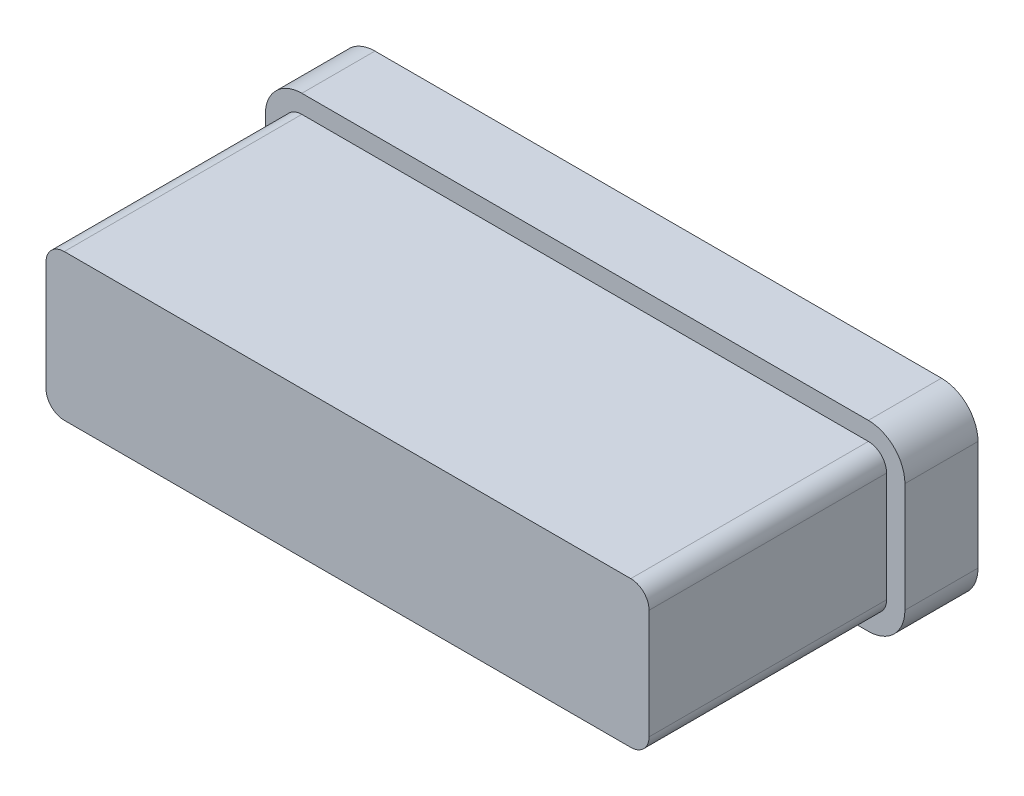
ISO-10303-21;
HEADER;
FILE_DESCRIPTION(('STEP AP214'),'2;1');
FILE_NAME('part.step','',(''),(''),'','','');
FILE_SCHEMA(('AUTOMOTIVE_DESIGN { 1 0 10303 214 1 1 1 1 }'));
ENDSEC;
DATA;
#1=APPLICATION_CONTEXT('core data for automotive mechanical design processes');
#2=APPLICATION_PROTOCOL_DEFINITION('international standard','automotive_design',2000,#1);
#3=PRODUCT_CONTEXT('',#1,'mechanical');
#4=PRODUCT('Part','Part','',(#3));
#5=PRODUCT_RELATED_PRODUCT_CATEGORY('part','',(#4));
#6=PRODUCT_DEFINITION_FORMATION('','',#4);
#7=PRODUCT_DEFINITION_CONTEXT('part definition',#1,'design');
#8=PRODUCT_DEFINITION('design','',#6,#7);
#9=PRODUCT_DEFINITION_SHAPE('','',#8);
#10=(LENGTH_UNIT() NAMED_UNIT(*) SI_UNIT(.MILLI.,.METRE.));
#11=(NAMED_UNIT(*) PLANE_ANGLE_UNIT() SI_UNIT($,.RADIAN.));
#12=(NAMED_UNIT(*) SI_UNIT($,.STERADIAN.) SOLID_ANGLE_UNIT());
#13=UNCERTAINTY_MEASURE_WITH_UNIT(LENGTH_MEASURE(1.E-05),#10,'distance_accuracy_value','');
#14=(GEOMETRIC_REPRESENTATION_CONTEXT(3) GLOBAL_UNCERTAINTY_ASSIGNED_CONTEXT((#13)) GLOBAL_UNIT_ASSIGNED_CONTEXT((#10,
#11,#12)) REPRESENTATION_CONTEXT('',''));
#15=CARTESIAN_POINT('',(0.,0.,0.));
#16=DIRECTION('',(0.,0.,1.));
#17=DIRECTION('',(1.,0.,0.));
#18=AXIS2_PLACEMENT_3D('',#15,#16,#17);
#19=CARTESIAN_POINT('',(0.,0.,4.));
#20=DIRECTION('',(0.,0.,-1.));
#21=DIRECTION('',(-1.,0.,0.));
#22=AXIS2_PLACEMENT_3D('',#19,#20,#21);
#23=PLANE('',#22);
#24=DIRECTION('',(0.,-1.,0.));
#25=VECTOR('',#24,1.);
#26=CARTESIAN_POINT('',(-17.5,-5.,4.));
#27=LINE('',#26,#25);
#28=CARTESIAN_POINT('',(-17.5,3.,4.));
#29=VERTEX_POINT('',#28);
#30=CARTESIAN_POINT('',(-17.5,-3.,4.));
#31=VERTEX_POINT('',#30);
#32=EDGE_CURVE('E196',#29,#31,#27,.T.);
#33=ORIENTED_EDGE('',*,*,#32,.T.);
#34=CARTESIAN_POINT('',(-15.5,-3.,4.));
#35=DIRECTION('',(0.,0.,-1.));
#36=DIRECTION('',(-1.,0.,0.));
#37=AXIS2_PLACEMENT_3D('',#34,#35,#36);
#38=CIRCLE('',#37,2.);
#39=CARTESIAN_POINT('',(-15.5,-5.,4.));
#40=VERTEX_POINT('',#39);
#41=EDGE_CURVE('E249',#31,#40,#38,.F.);
#42=ORIENTED_EDGE('',*,*,#41,.T.);
#43=DIRECTION('',(1.,0.,0.));
#44=VECTOR('',#43,1.);
#45=CARTESIAN_POINT('',(-17.5,-5.,4.));
#46=LINE('',#45,#44);
#47=CARTESIAN_POINT('',(15.5,-5.,4.));
#48=VERTEX_POINT('',#47);
#49=EDGE_CURVE('E200',#40,#48,#46,.T.);
#50=ORIENTED_EDGE('',*,*,#49,.T.);
#51=CARTESIAN_POINT('',(15.5,-3.,4.));
#52=DIRECTION('',(0.,0.,-1.));
#53=DIRECTION('',(-1.,0.,0.));
#54=AXIS2_PLACEMENT_3D('',#51,#52,#53);
#55=CIRCLE('',#54,2.);
#56=CARTESIAN_POINT('',(17.5,-3.,4.));
#57=VERTEX_POINT('',#56);
#58=EDGE_CURVE('E243',#48,#57,#55,.F.);
#59=ORIENTED_EDGE('',*,*,#58,.T.);
#60=DIRECTION('',(0.,1.,0.));
#61=VECTOR('',#60,1.);
#62=CARTESIAN_POINT('',(17.5,-5.,4.));
#63=LINE('',#62,#61);
#64=CARTESIAN_POINT('',(17.5,3.,4.));
#65=VERTEX_POINT('',#64);
#66=EDGE_CURVE('E187',#57,#65,#63,.T.);
#67=ORIENTED_EDGE('',*,*,#66,.T.);
#68=CARTESIAN_POINT('',(15.5,3.,4.));
#69=DIRECTION('',(0.,0.,-1.));
#70=DIRECTION('',(-1.,0.,0.));
#71=AXIS2_PLACEMENT_3D('',#68,#69,#70);
#72=CIRCLE('',#71,2.);
#73=CARTESIAN_POINT('',(15.5,5.,4.));
#74=VERTEX_POINT('',#73);
#75=EDGE_CURVE('E240',#65,#74,#72,.F.);
#76=ORIENTED_EDGE('',*,*,#75,.T.);
#77=DIRECTION('',(-1.,0.,0.));
#78=VECTOR('',#77,1.);
#79=CARTESIAN_POINT('',(-17.5,5.,4.));
#80=LINE('',#79,#78);
#81=CARTESIAN_POINT('',(-15.5,5.,4.));
#82=VERTEX_POINT('',#81);
#83=EDGE_CURVE('E191',#74,#82,#80,.T.);
#84=ORIENTED_EDGE('',*,*,#83,.T.);
#85=CARTESIAN_POINT('',(-15.5,3.,4.));
#86=DIRECTION('',(0.,0.,-1.));
#87=DIRECTION('',(-1.,0.,0.));
#88=AXIS2_PLACEMENT_3D('',#85,#86,#87);
#89=CIRCLE('',#88,2.);
#90=EDGE_CURVE('E246',#82,#29,#89,.F.);
#91=ORIENTED_EDGE('',*,*,#90,.T.);
#92=EDGE_LOOP('',(#33,#42,#50,#59,#67,#76,#84,#91));
#93=FACE_BOUND('',#92,.T.);
#94=CARTESIAN_POINT('',(-15.5,3.,4.));
#95=DIRECTION('',(0.,0.,1.));
#96=DIRECTION('',(1.,0.,0.));
#97=AXIS2_PLACEMENT_3D('',#94,#95,#96);
#98=CIRCLE('',#97,1.);
#99=CARTESIAN_POINT('',(-15.5,4.,4.));
#100=VERTEX_POINT('',#99);
#101=CARTESIAN_POINT('',(-16.5,3.,4.));
#102=VERTEX_POINT('',#101);
#103=EDGE_CURVE('E55',#100,#102,#98,.T.);
#104=ORIENTED_EDGE('',*,*,#103,.F.);
#105=DIRECTION('',(-1.,0.,0.));
#106=VECTOR('',#105,1.);
#107=CARTESIAN_POINT('',(15.5,4.,4.));
#108=LINE('',#107,#106);
#109=CARTESIAN_POINT('',(15.5,4.,4.));
#110=VERTEX_POINT('',#109);
#111=EDGE_CURVE('E59',#110,#100,#108,.T.);
#112=ORIENTED_EDGE('',*,*,#111,.F.);
#113=CARTESIAN_POINT('',(15.5,3.,4.));
#114=DIRECTION('',(0.,0.,1.));
#115=DIRECTION('',(1.,0.,0.));
#116=AXIS2_PLACEMENT_3D('',#113,#114,#115);
#117=CIRCLE('',#116,1.);
#118=CARTESIAN_POINT('',(16.5,3.,4.));
#119=VERTEX_POINT('',#118);
#120=EDGE_CURVE('E434',#119,#110,#117,.T.);
#121=ORIENTED_EDGE('',*,*,#120,.F.);
#122=DIRECTION('',(0.,1.,0.));
#123=VECTOR('',#122,1.);
#124=CARTESIAN_POINT('',(16.5,-3.,4.));
#125=LINE('',#124,#123);
#126=CARTESIAN_POINT('',(16.5,-3.,4.));
#127=VERTEX_POINT('',#126);
#128=EDGE_CURVE('E479',#127,#119,#125,.T.);
#129=ORIENTED_EDGE('',*,*,#128,.F.);
#130=CARTESIAN_POINT('',(15.5,-3.,4.));
#131=DIRECTION('',(0.,0.,1.));
#132=DIRECTION('',(1.,0.,0.));
#133=AXIS2_PLACEMENT_3D('',#130,#131,#132);
#134=CIRCLE('',#133,1.);
#135=CARTESIAN_POINT('',(15.5,-4.,4.));
#136=VERTEX_POINT('',#135);
#137=EDGE_CURVE('E471',#136,#127,#134,.T.);
#138=ORIENTED_EDGE('',*,*,#137,.F.);
#139=DIRECTION('',(1.,0.,0.));
#140=VECTOR('',#139,1.);
#141=CARTESIAN_POINT('',(-15.5,-4.,4.));
#142=LINE('',#141,#140);
#143=CARTESIAN_POINT('',(-15.5,-4.,4.));
#144=VERTEX_POINT('',#143);
#145=EDGE_CURVE('E462',#144,#136,#142,.T.);
#146=ORIENTED_EDGE('',*,*,#145,.F.);
#147=CARTESIAN_POINT('',(-15.5,-3.,4.));
#148=DIRECTION('',(0.,0.,1.));
#149=DIRECTION('',(1.,0.,0.));
#150=AXIS2_PLACEMENT_3D('',#147,#148,#149);
#151=CIRCLE('',#150,1.);
#152=CARTESIAN_POINT('',(-16.5,-3.,4.));
#153=VERTEX_POINT('',#152);
#154=EDGE_CURVE('E465',#153,#144,#151,.T.);
#155=ORIENTED_EDGE('',*,*,#154,.F.);
#156=DIRECTION('',(0.,-1.,0.));
#157=VECTOR('',#156,1.);
#158=CARTESIAN_POINT('',(-16.5,3.,4.));
#159=LINE('',#158,#157);
#160=EDGE_CURVE('E467',#102,#153,#159,.T.);
#161=ORIENTED_EDGE('',*,*,#160,.F.);
#162=EDGE_LOOP('',(#104,#112,#121,#129,#138,#146,#155,#161));
#163=FACE_BOUND('',#162,.T.);
#164=ADVANCED_FACE('F39',(#93,#163),#23,.F.);
#165=CARTESIAN_POINT('',(17.5,-5.,4.));
#166=DIRECTION('',(-1.,0.,0.));
#167=DIRECTION('',(0.,0.,1.));
#168=AXIS2_PLACEMENT_3D('',#165,#166,#167);
#169=PLANE('',#168);
#170=ORIENTED_EDGE('',*,*,#66,.F.);
#171=DIRECTION('',(0.,0.,-1.));
#172=VECTOR('',#171,1.);
#173=CARTESIAN_POINT('',(17.5,-3.,4.));
#174=LINE('',#173,#172);
#175=CARTESIAN_POINT('',(17.5,-3.,0.));
#176=VERTEX_POINT('',#175);
#177=EDGE_CURVE('E11',#57,#176,#174,.T.);
#178=ORIENTED_EDGE('',*,*,#177,.T.);
#179=DIRECTION('',(0.,1.,0.));
#180=VECTOR('',#179,1.);
#181=CARTESIAN_POINT('',(17.5,-5.,0.));
#182=LINE('',#181,#180);
#183=CARTESIAN_POINT('',(17.5,3.,0.));
#184=VERTEX_POINT('',#183);
#185=EDGE_CURVE('E176',#176,#184,#182,.T.);
#186=ORIENTED_EDGE('',*,*,#185,.T.);
#187=DIRECTION('',(0.,0.,-1.));
#188=VECTOR('',#187,1.);
#189=CARTESIAN_POINT('',(17.5,3.,4.));
#190=LINE('',#189,#188);
#191=EDGE_CURVE('E48',#184,#65,#190,.F.);
#192=ORIENTED_EDGE('',*,*,#191,.T.);
#193=EDGE_LOOP('',(#170,#178,#186,#192));
#194=FACE_BOUND('',#193,.T.);
#195=ADVANCED_FACE('F262',(#194),#169,.F.);
#196=CARTESIAN_POINT('',(-17.5,5.,4.));
#197=DIRECTION('',(0.,-1.,0.));
#198=DIRECTION('',(0.,0.,-1.));
#199=AXIS2_PLACEMENT_3D('',#196,#197,#198);
#200=PLANE('',#199);
#201=DIRECTION('',(-1.,0.,0.));
#202=VECTOR('',#201,1.);
#203=CARTESIAN_POINT('',(-17.5,5.,0.));
#204=LINE('',#203,#202);
#205=CARTESIAN_POINT('',(15.5,5.,0.));
#206=VERTEX_POINT('',#205);
#207=CARTESIAN_POINT('',(-15.5,5.,0.));
#208=VERTEX_POINT('',#207);
#209=EDGE_CURVE('E181',#206,#208,#204,.T.);
#210=ORIENTED_EDGE('',*,*,#209,.T.);
#211=DIRECTION('',(0.,0.,-1.));
#212=VECTOR('',#211,1.);
#213=CARTESIAN_POINT('',(-15.5,5.,4.));
#214=LINE('',#213,#212);
#215=EDGE_CURVE('E256',#208,#82,#214,.F.);
#216=ORIENTED_EDGE('',*,*,#215,.T.);
#217=ORIENTED_EDGE('',*,*,#83,.F.);
#218=DIRECTION('',(0.,0.,-1.));
#219=VECTOR('',#218,1.);
#220=CARTESIAN_POINT('',(15.5,5.,4.));
#221=LINE('',#220,#219);
#222=EDGE_CURVE('E252',#74,#206,#221,.T.);
#223=ORIENTED_EDGE('',*,*,#222,.T.);
#224=EDGE_LOOP('',(#210,#216,#217,#223));
#225=FACE_BOUND('',#224,.T.);
#226=ADVANCED_FACE('F273',(#225),#200,.F.);
#227=CARTESIAN_POINT('',(-17.5,-5.,4.));
#228=DIRECTION('',(1.,0.,0.));
#229=DIRECTION('',(0.,0.,-1.));
#230=AXIS2_PLACEMENT_3D('',#227,#228,#229);
#231=PLANE('',#230);
#232=DIRECTION('',(0.,-1.,0.));
#233=VECTOR('',#232,1.);
#234=CARTESIAN_POINT('',(-17.5,-5.,0.));
#235=LINE('',#234,#233);
#236=CARTESIAN_POINT('',(-17.5,3.,0.));
#237=VERTEX_POINT('',#236);
#238=CARTESIAN_POINT('',(-17.5,-3.,0.));
#239=VERTEX_POINT('',#238);
#240=EDGE_CURVE('E208',#237,#239,#235,.T.);
#241=ORIENTED_EDGE('',*,*,#240,.T.);
#242=DIRECTION('',(0.,0.,-1.));
#243=VECTOR('',#242,1.);
#244=CARTESIAN_POINT('',(-17.5,-3.,4.));
#245=LINE('',#244,#243);
#246=EDGE_CURVE('E237',#239,#31,#245,.F.);
#247=ORIENTED_EDGE('',*,*,#246,.T.);
#248=ORIENTED_EDGE('',*,*,#32,.F.);
#249=DIRECTION('',(0.,0.,-1.));
#250=VECTOR('',#249,1.);
#251=CARTESIAN_POINT('',(-17.5,3.,4.));
#252=LINE('',#251,#250);
#253=EDGE_CURVE('E233',#29,#237,#252,.T.);
#254=ORIENTED_EDGE('',*,*,#253,.T.);
#255=EDGE_LOOP('',(#241,#247,#248,#254));
#256=FACE_BOUND('',#255,.T.);
#257=ADVANCED_FACE('F285',(#256),#231,.F.);
#258=CARTESIAN_POINT('',(-17.5,-5.,4.));
#259=DIRECTION('',(0.,1.,0.));
#260=DIRECTION('',(0.,0.,1.));
#261=AXIS2_PLACEMENT_3D('',#258,#259,#260);
#262=PLANE('',#261);
#263=ORIENTED_EDGE('',*,*,#49,.F.);
#264=DIRECTION('',(0.,0.,-1.));
#265=VECTOR('',#264,1.);
#266=CARTESIAN_POINT('',(-15.5,-5.,4.));
#267=LINE('',#266,#265);
#268=CARTESIAN_POINT('',(-15.5,-5.,0.));
#269=VERTEX_POINT('',#268);
#270=EDGE_CURVE('E217',#40,#269,#267,.T.);
#271=ORIENTED_EDGE('',*,*,#270,.T.);
#272=DIRECTION('',(1.,0.,0.));
#273=VECTOR('',#272,1.);
#274=CARTESIAN_POINT('',(-17.5,-5.,0.));
#275=LINE('',#274,#273);
#276=CARTESIAN_POINT('',(15.5,-5.,0.));
#277=VERTEX_POINT('',#276);
#278=EDGE_CURVE('E192',#269,#277,#275,.T.);
#279=ORIENTED_EDGE('',*,*,#278,.T.);
#280=DIRECTION('',(0.,0.,-1.));
#281=VECTOR('',#280,1.);
#282=CARTESIAN_POINT('',(15.5,-5.,4.));
#283=LINE('',#282,#281);
#284=EDGE_CURVE('E203',#277,#48,#283,.F.);
#285=ORIENTED_EDGE('',*,*,#284,.T.);
#286=EDGE_LOOP('',(#263,#271,#279,#285));
#287=FACE_BOUND('',#286,.T.);
#288=ADVANCED_FACE('F293',(#287),#262,.F.);
#289=CARTESIAN_POINT('',(0.,0.,0.));
#290=DIRECTION('',(0.,0.,-1.));
#291=DIRECTION('',(-1.,0.,0.));
#292=AXIS2_PLACEMENT_3D('',#289,#290,#291);
#293=PLANE('',#292);
#294=ORIENTED_EDGE('',*,*,#278,.F.);
#295=CARTESIAN_POINT('',(-15.5,-3.,0.));
#296=DIRECTION('',(0.,0.,-1.));
#297=DIRECTION('',(-1.,0.,0.));
#298=AXIS2_PLACEMENT_3D('',#295,#296,#297);
#299=CIRCLE('',#298,2.);
#300=EDGE_CURVE('E230',#269,#239,#299,.T.);
#301=ORIENTED_EDGE('',*,*,#300,.T.);
#302=ORIENTED_EDGE('',*,*,#240,.F.);
#303=CARTESIAN_POINT('',(-15.5,3.,0.));
#304=DIRECTION('',(0.,0.,-1.));
#305=DIRECTION('',(-1.,0.,0.));
#306=AXIS2_PLACEMENT_3D('',#303,#304,#305);
#307=CIRCLE('',#306,2.);
#308=EDGE_CURVE('E227',#237,#208,#307,.T.);
#309=ORIENTED_EDGE('',*,*,#308,.T.);
#310=ORIENTED_EDGE('',*,*,#209,.F.);
#311=CARTESIAN_POINT('',(15.5,3.,0.));
#312=DIRECTION('',(0.,0.,-1.));
#313=DIRECTION('',(-1.,0.,0.));
#314=AXIS2_PLACEMENT_3D('',#311,#312,#313);
#315=CIRCLE('',#314,2.);
#316=EDGE_CURVE('E221',#206,#184,#315,.T.);
#317=ORIENTED_EDGE('',*,*,#316,.T.);
#318=ORIENTED_EDGE('',*,*,#185,.F.);
#319=CARTESIAN_POINT('',(15.5,-3.,0.));
#320=DIRECTION('',(0.,0.,-1.));
#321=DIRECTION('',(-1.,0.,0.));
#322=AXIS2_PLACEMENT_3D('',#319,#320,#321);
#323=CIRCLE('',#322,2.);
#324=EDGE_CURVE('E224',#176,#277,#323,.T.);
#325=ORIENTED_EDGE('',*,*,#324,.T.);
#326=EDGE_LOOP('',(#294,#301,#302,#309,#310,#317,#318,#325));
#327=FACE_BOUND('',#326,.T.);
#328=ADVANCED_FACE('F277',(#327),#293,.T.);
#329=CARTESIAN_POINT('',(-15.5,-3.,4.));
#330=DIRECTION('',(0.,0.,-1.));
#331=DIRECTION('',(-1.,0.,0.));
#332=AXIS2_PLACEMENT_3D('',#329,#330,#331);
#333=CYLINDRICAL_SURFACE('',#332,2.);
#334=ORIENTED_EDGE('',*,*,#41,.F.);
#335=ORIENTED_EDGE('',*,*,#246,.F.);
#336=ORIENTED_EDGE('',*,*,#300,.F.);
#337=ORIENTED_EDGE('',*,*,#270,.F.);
#338=EDGE_LOOP('',(#334,#335,#336,#337));
#339=FACE_BOUND('',#338,.T.);
#340=ADVANCED_FACE('F291',(#339),#333,.T.);
#341=CARTESIAN_POINT('',(-15.5,3.,4.));
#342=DIRECTION('',(0.,0.,-1.));
#343=DIRECTION('',(-1.,0.,0.));
#344=AXIS2_PLACEMENT_3D('',#341,#342,#343);
#345=CYLINDRICAL_SURFACE('',#344,2.);
#346=ORIENTED_EDGE('',*,*,#90,.F.);
#347=ORIENTED_EDGE('',*,*,#215,.F.);
#348=ORIENTED_EDGE('',*,*,#308,.F.);
#349=ORIENTED_EDGE('',*,*,#253,.F.);
#350=EDGE_LOOP('',(#346,#347,#348,#349));
#351=FACE_BOUND('',#350,.T.);
#352=ADVANCED_FACE('F282',(#351),#345,.T.);
#353=CARTESIAN_POINT('',(15.5,-3.,4.));
#354=DIRECTION('',(0.,0.,-1.));
#355=DIRECTION('',(-1.,0.,0.));
#356=AXIS2_PLACEMENT_3D('',#353,#354,#355);
#357=CYLINDRICAL_SURFACE('',#356,2.);
#358=ORIENTED_EDGE('',*,*,#58,.F.);
#359=ORIENTED_EDGE('',*,*,#284,.F.);
#360=ORIENTED_EDGE('',*,*,#324,.F.);
#361=ORIENTED_EDGE('',*,*,#177,.F.);
#362=EDGE_LOOP('',(#358,#359,#360,#361));
#363=FACE_BOUND('',#362,.T.);
#364=ADVANCED_FACE('F296',(#363),#357,.T.);
#365=CARTESIAN_POINT('',(15.5,3.,4.));
#366=DIRECTION('',(0.,0.,-1.));
#367=DIRECTION('',(-1.,0.,0.));
#368=AXIS2_PLACEMENT_3D('',#365,#366,#367);
#369=CYLINDRICAL_SURFACE('',#368,2.);
#370=ORIENTED_EDGE('',*,*,#75,.F.);
#371=ORIENTED_EDGE('',*,*,#191,.F.);
#372=ORIENTED_EDGE('',*,*,#316,.F.);
#373=ORIENTED_EDGE('',*,*,#222,.F.);
#374=EDGE_LOOP('',(#370,#371,#372,#373));
#375=FACE_BOUND('',#374,.T.);
#376=ADVANCED_FACE('F41',(#375),#369,.T.);
#377=CARTESIAN_POINT('',(-15.5,3.,17.));
#378=DIRECTION('',(0.,0.,-1.));
#379=DIRECTION('',(-1.,0.,0.));
#380=AXIS2_PLACEMENT_3D('',#377,#378,#379);
#381=CYLINDRICAL_SURFACE('',#380,1.);
#382=ORIENTED_EDGE('',*,*,#103,.T.);
#383=DIRECTION('',(0.,0.,-1.));
#384=VECTOR('',#383,1.);
#385=CARTESIAN_POINT('',(-16.5,3.,17.));
#386=LINE('',#385,#384);
#387=CARTESIAN_POINT('',(-16.5,3.,17.));
#388=VERTEX_POINT('',#387);
#389=EDGE_CURVE('E156',#388,#102,#386,.T.);
#390=ORIENTED_EDGE('',*,*,#389,.F.);
#391=CARTESIAN_POINT('',(-15.5,3.,17.));
#392=DIRECTION('',(0.,0.,1.));
#393=DIRECTION('',(1.,0.,0.));
#394=AXIS2_PLACEMENT_3D('',#391,#392,#393);
#395=CIRCLE('',#394,1.);
#396=CARTESIAN_POINT('',(-15.5,4.,17.));
#397=VERTEX_POINT('',#396);
#398=EDGE_CURVE('E163',#397,#388,#395,.T.);
#399=ORIENTED_EDGE('',*,*,#398,.F.);
#400=DIRECTION('',(0.,0.,-1.));
#401=VECTOR('',#400,1.);
#402=CARTESIAN_POINT('',(-15.5,4.,17.));
#403=LINE('',#402,#401);
#404=EDGE_CURVE('E430',#397,#100,#403,.T.);
#405=ORIENTED_EDGE('',*,*,#404,.T.);
#406=EDGE_LOOP('',(#382,#390,#399,#405));
#407=FACE_BOUND('',#406,.T.);
#408=ADVANCED_FACE('F174',(#407),#381,.T.);
#409=CARTESIAN_POINT('',(-16.5,3.,17.));
#410=DIRECTION('',(1.,0.,0.));
#411=DIRECTION('',(0.,0.,-1.));
#412=AXIS2_PLACEMENT_3D('',#409,#410,#411);
#413=PLANE('',#412);
#414=ORIENTED_EDGE('',*,*,#160,.T.);
#415=DIRECTION('',(0.,0.,-1.));
#416=VECTOR('',#415,1.);
#417=CARTESIAN_POINT('',(-16.5,-3.,17.));
#418=LINE('',#417,#416);
#419=CARTESIAN_POINT('',(-16.5,-3.,17.));
#420=VERTEX_POINT('',#419);
#421=EDGE_CURVE('E158',#420,#153,#418,.T.);
#422=ORIENTED_EDGE('',*,*,#421,.F.);
#423=DIRECTION('',(0.,-1.,0.));
#424=VECTOR('',#423,1.);
#425=CARTESIAN_POINT('',(-16.5,3.,17.));
#426=LINE('',#425,#424);
#427=EDGE_CURVE('E151',#388,#420,#426,.T.);
#428=ORIENTED_EDGE('',*,*,#427,.F.);
#429=ORIENTED_EDGE('',*,*,#389,.T.);
#430=EDGE_LOOP('',(#414,#422,#428,#429));
#431=FACE_BOUND('',#430,.T.);
#432=ADVANCED_FACE('F154',(#431),#413,.F.);
#433=CARTESIAN_POINT('',(-15.5,-3.,17.));
#434=DIRECTION('',(0.,0.,-1.));
#435=DIRECTION('',(-1.,0.,0.));
#436=AXIS2_PLACEMENT_3D('',#433,#434,#435);
#437=CYLINDRICAL_SURFACE('',#436,1.);
#438=ORIENTED_EDGE('',*,*,#154,.T.);
#439=DIRECTION('',(0.,0.,-1.));
#440=VECTOR('',#439,1.);
#441=CARTESIAN_POINT('',(-15.5,-4.,17.));
#442=LINE('',#441,#440);
#443=CARTESIAN_POINT('',(-15.5,-4.,17.));
#444=VERTEX_POINT('',#443);
#445=EDGE_CURVE('E183',#444,#144,#442,.T.);
#446=ORIENTED_EDGE('',*,*,#445,.F.);
#447=CARTESIAN_POINT('',(-15.5,-3.,17.));
#448=DIRECTION('',(0.,0.,1.));
#449=DIRECTION('',(1.,0.,0.));
#450=AXIS2_PLACEMENT_3D('',#447,#448,#449);
#451=CIRCLE('',#450,1.);
#452=EDGE_CURVE('E162',#420,#444,#451,.T.);
#453=ORIENTED_EDGE('',*,*,#452,.F.);
#454=ORIENTED_EDGE('',*,*,#421,.T.);
#455=EDGE_LOOP('',(#438,#446,#453,#454));
#456=FACE_BOUND('',#455,.T.);
#457=ADVANCED_FACE('F359',(#456),#437,.T.);
#458=CARTESIAN_POINT('',(-15.5,-4.,17.));
#459=DIRECTION('',(0.,1.,0.));
#460=DIRECTION('',(0.,0.,1.));
#461=AXIS2_PLACEMENT_3D('',#458,#459,#460);
#462=PLANE('',#461);
#463=ORIENTED_EDGE('',*,*,#145,.T.);
#464=DIRECTION('',(0.,0.,-1.));
#465=VECTOR('',#464,1.);
#466=CARTESIAN_POINT('',(15.5,-4.,17.));
#467=LINE('',#466,#465);
#468=CARTESIAN_POINT('',(15.5,-4.,17.));
#469=VERTEX_POINT('',#468);
#470=EDGE_CURVE('E453',#469,#136,#467,.T.);
#471=ORIENTED_EDGE('',*,*,#470,.F.);
#472=DIRECTION('',(1.,0.,0.));
#473=VECTOR('',#472,1.);
#474=CARTESIAN_POINT('',(-15.5,-4.,17.));
#475=LINE('',#474,#473);
#476=EDGE_CURVE('E463',#444,#469,#475,.T.);
#477=ORIENTED_EDGE('',*,*,#476,.F.);
#478=ORIENTED_EDGE('',*,*,#445,.T.);
#479=EDGE_LOOP('',(#463,#471,#477,#478));
#480=FACE_BOUND('',#479,.T.);
#481=ADVANCED_FACE('F367',(#480),#462,.F.);
#482=CARTESIAN_POINT('',(15.5,-3.,17.));
#483=DIRECTION('',(0.,0.,-1.));
#484=DIRECTION('',(-1.,0.,0.));
#485=AXIS2_PLACEMENT_3D('',#482,#483,#484);
#486=CYLINDRICAL_SURFACE('',#485,1.);
#487=ORIENTED_EDGE('',*,*,#137,.T.);
#488=DIRECTION('',(0.,0.,-1.));
#489=VECTOR('',#488,1.);
#490=CARTESIAN_POINT('',(16.5,-3.,17.));
#491=LINE('',#490,#489);
#492=CARTESIAN_POINT('',(16.5,-3.,17.));
#493=VERTEX_POINT('',#492);
#494=EDGE_CURVE('E449',#493,#127,#491,.T.);
#495=ORIENTED_EDGE('',*,*,#494,.F.);
#496=CARTESIAN_POINT('',(15.5,-3.,17.));
#497=DIRECTION('',(0.,0.,1.));
#498=DIRECTION('',(1.,0.,0.));
#499=AXIS2_PLACEMENT_3D('',#496,#497,#498);
#500=CIRCLE('',#499,1.);
#501=EDGE_CURVE('E489',#469,#493,#500,.T.);
#502=ORIENTED_EDGE('',*,*,#501,.F.);
#503=ORIENTED_EDGE('',*,*,#470,.T.);
#504=EDGE_LOOP('',(#487,#495,#502,#503));
#505=FACE_BOUND('',#504,.T.);
#506=ADVANCED_FACE('F377',(#505),#486,.T.);
#507=CARTESIAN_POINT('',(16.5,-3.,17.));
#508=DIRECTION('',(-1.,0.,0.));
#509=DIRECTION('',(0.,0.,1.));
#510=AXIS2_PLACEMENT_3D('',#507,#508,#509);
#511=PLANE('',#510);
#512=ORIENTED_EDGE('',*,*,#128,.T.);
#513=DIRECTION('',(0.,0.,-1.));
#514=VECTOR('',#513,1.);
#515=CARTESIAN_POINT('',(16.5,3.,17.));
#516=LINE('',#515,#514);
#517=CARTESIAN_POINT('',(16.5,3.,17.));
#518=VERTEX_POINT('',#517);
#519=EDGE_CURVE('E440',#518,#119,#516,.T.);
#520=ORIENTED_EDGE('',*,*,#519,.F.);
#521=DIRECTION('',(0.,1.,0.));
#522=VECTOR('',#521,1.);
#523=CARTESIAN_POINT('',(16.5,-3.,17.));
#524=LINE('',#523,#522);
#525=EDGE_CURVE('E487',#493,#518,#524,.T.);
#526=ORIENTED_EDGE('',*,*,#525,.F.);
#527=ORIENTED_EDGE('',*,*,#494,.T.);
#528=EDGE_LOOP('',(#512,#520,#526,#527));
#529=FACE_BOUND('',#528,.T.);
#530=ADVANCED_FACE('F387',(#529),#511,.F.);
#531=CARTESIAN_POINT('',(15.5,3.,17.));
#532=DIRECTION('',(0.,0.,-1.));
#533=DIRECTION('',(-1.,0.,0.));
#534=AXIS2_PLACEMENT_3D('',#531,#532,#533);
#535=CYLINDRICAL_SURFACE('',#534,1.);
#536=ORIENTED_EDGE('',*,*,#120,.T.);
#537=DIRECTION('',(0.,0.,-1.));
#538=VECTOR('',#537,1.);
#539=CARTESIAN_POINT('',(15.5,4.,17.));
#540=LINE('',#539,#538);
#541=CARTESIAN_POINT('',(15.5,4.,17.));
#542=VERTEX_POINT('',#541);
#543=EDGE_CURVE('E432',#542,#110,#540,.T.);
#544=ORIENTED_EDGE('',*,*,#543,.F.);
#545=CARTESIAN_POINT('',(15.5,3.,17.));
#546=DIRECTION('',(0.,0.,1.));
#547=DIRECTION('',(1.,0.,0.));
#548=AXIS2_PLACEMENT_3D('',#545,#546,#547);
#549=CIRCLE('',#548,1.);
#550=EDGE_CURVE('E442',#518,#542,#549,.T.);
#551=ORIENTED_EDGE('',*,*,#550,.F.);
#552=ORIENTED_EDGE('',*,*,#519,.T.);
#553=EDGE_LOOP('',(#536,#544,#551,#552));
#554=FACE_BOUND('',#553,.T.);
#555=ADVANCED_FACE('F397',(#554),#535,.T.);
#556=CARTESIAN_POINT('',(15.5,4.,17.));
#557=DIRECTION('',(0.,-1.,0.));
#558=DIRECTION('',(1.,0.,0.));
#559=AXIS2_PLACEMENT_3D('',#556,#557,#558);
#560=PLANE('',#559);
#561=ORIENTED_EDGE('',*,*,#111,.T.);
#562=ORIENTED_EDGE('',*,*,#404,.F.);
#563=DIRECTION('',(-1.,0.,0.));
#564=VECTOR('',#563,1.);
#565=CARTESIAN_POINT('',(15.5,4.,17.));
#566=LINE('',#565,#564);
#567=EDGE_CURVE('E168',#542,#397,#566,.T.);
#568=ORIENTED_EDGE('',*,*,#567,.F.);
#569=ORIENTED_EDGE('',*,*,#543,.T.);
#570=EDGE_LOOP('',(#561,#562,#568,#569));
#571=FACE_BOUND('',#570,.T.);
#572=ADVANCED_FACE('F407',(#571),#560,.F.);
#573=CARTESIAN_POINT('',(-15.5,3.,17.));
#574=DIRECTION('',(0.,0.,1.));
#575=DIRECTION('',(1.,0.,0.));
#576=AXIS2_PLACEMENT_3D('',#573,#574,#575);
#577=PLANE('',#576);
#578=ORIENTED_EDGE('',*,*,#398,.T.);
#579=ORIENTED_EDGE('',*,*,#427,.T.);
#580=ORIENTED_EDGE('',*,*,#452,.T.);
#581=ORIENTED_EDGE('',*,*,#476,.T.);
#582=ORIENTED_EDGE('',*,*,#501,.T.);
#583=ORIENTED_EDGE('',*,*,#525,.T.);
#584=ORIENTED_EDGE('',*,*,#550,.T.);
#585=ORIENTED_EDGE('',*,*,#567,.T.);
#586=EDGE_LOOP('',(#578,#579,#580,#581,#582,#583,#584,#585));
#587=FACE_BOUND('',#586,.T.);
#588=ADVANCED_FACE('F166',(#587),#577,.T.);
#589=CLOSED_SHELL('',(#164,#195,#226,#257,#288,#328,#340,#352,#364,#376,#408,#432,#457,#481,
#506,#530,#555,#572,#588));
#590=MANIFOLD_SOLID_BREP('B2',#589);
#591=ADVANCED_BREP_SHAPE_REPRESENTATION('',(#18,#590),#14);
#592=SHAPE_DEFINITION_REPRESENTATION(#9,#591);
ENDSEC;
END-ISO-10303-21;
